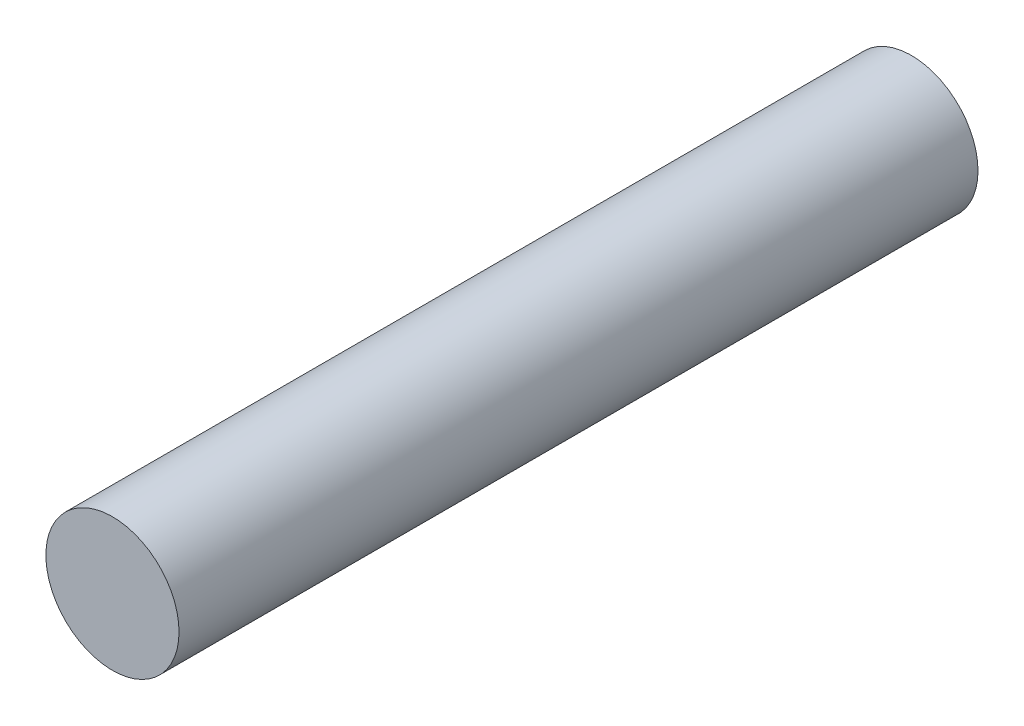
ISO-10303-21;
HEADER;
FILE_DESCRIPTION(('STEP AP214'),'2;1');
FILE_NAME('part.step','',(''),(''),'','','');
FILE_SCHEMA(('AUTOMOTIVE_DESIGN { 1 0 10303 214 1 1 1 1 }'));
ENDSEC;
DATA;
#1=APPLICATION_CONTEXT('core data for automotive mechanical design processes');
#2=APPLICATION_PROTOCOL_DEFINITION('international standard','automotive_design',2000,#1);
#3=PRODUCT_CONTEXT('',#1,'mechanical');
#4=PRODUCT('Part','Part','',(#3));
#5=PRODUCT_RELATED_PRODUCT_CATEGORY('part','',(#4));
#6=PRODUCT_DEFINITION_FORMATION('','',#4);
#7=PRODUCT_DEFINITION_CONTEXT('part definition',#1,'design');
#8=PRODUCT_DEFINITION('design','',#6,#7);
#9=PRODUCT_DEFINITION_SHAPE('','',#8);
#10=(LENGTH_UNIT() NAMED_UNIT(*) SI_UNIT(.MILLI.,.METRE.));
#11=(NAMED_UNIT(*) PLANE_ANGLE_UNIT() SI_UNIT($,.RADIAN.));
#12=(NAMED_UNIT(*) SI_UNIT($,.STERADIAN.) SOLID_ANGLE_UNIT());
#13=UNCERTAINTY_MEASURE_WITH_UNIT(LENGTH_MEASURE(1.E-05),#10,'distance_accuracy_value','');
#14=(GEOMETRIC_REPRESENTATION_CONTEXT(3) GLOBAL_UNCERTAINTY_ASSIGNED_CONTEXT((#13)) GLOBAL_UNIT_ASSIGNED_CONTEXT((#10,
#11,#12)) REPRESENTATION_CONTEXT('',''));
#15=CARTESIAN_POINT('',(0.,0.,0.));
#16=DIRECTION('',(0.,0.,1.));
#17=DIRECTION('',(1.,0.,0.));
#18=AXIS2_PLACEMENT_3D('',#15,#16,#17);
#19=CARTESIAN_POINT('',(0.,0.,150.));
#20=DIRECTION('',(0.,0.,-1.));
#21=DIRECTION('',(-1.,0.,0.));
#22=AXIS2_PLACEMENT_3D('',#19,#20,#21);
#23=CYLINDRICAL_SURFACE('',#22,12.5);
#24=CARTESIAN_POINT('',(0.,0.,150.));
#25=DIRECTION('',(0.,0.,1.));
#26=DIRECTION('',(1.,0.,0.));
#27=AXIS2_PLACEMENT_3D('',#24,#25,#26);
#28=CIRCLE('',#27,12.5);
#29=CARTESIAN_POINT('',(12.5,0.,150.));
#30=VERTEX_POINT('',#29);
#31=EDGE_CURVE('E10',#30,#30,#28,.T.);
#32=ORIENTED_EDGE('',*,*,#31,.F.);
#33=EDGE_LOOP('',(#32));
#34=FACE_BOUND('',#33,.T.);
#35=CARTESIAN_POINT('',(0.,0.,0.));
#36=DIRECTION('',(0.,0.,1.));
#37=DIRECTION('',(1.,0.,0.));
#38=AXIS2_PLACEMENT_3D('',#35,#36,#37);
#39=CIRCLE('',#38,12.5);
#40=CARTESIAN_POINT('',(12.5,0.,0.));
#41=VERTEX_POINT('',#40);
#42=EDGE_CURVE('E32',#41,#41,#39,.T.);
#43=ORIENTED_EDGE('',*,*,#42,.T.);
#44=EDGE_LOOP('',(#43));
#45=FACE_BOUND('',#44,.T.);
#46=ADVANCED_FACE('F29',(#34,#45),#23,.T.);
#47=CARTESIAN_POINT('',(0.,0.,150.));
#48=DIRECTION('',(0.,0.,1.));
#49=DIRECTION('',(1.,0.,0.));
#50=AXIS2_PLACEMENT_3D('',#47,#48,#49);
#51=PLANE('',#50);
#52=ORIENTED_EDGE('',*,*,#31,.T.);
#53=EDGE_LOOP('',(#52));
#54=FACE_BOUND('',#53,.T.);
#55=ADVANCED_FACE('F44',(#54),#51,.T.);
#56=CARTESIAN_POINT('',(0.,0.,0.));
#57=DIRECTION('',(0.,0.,1.));
#58=DIRECTION('',(1.,0.,0.));
#59=AXIS2_PLACEMENT_3D('',#56,#57,#58);
#60=PLANE('',#59);
#61=ORIENTED_EDGE('',*,*,#42,.F.);
#62=EDGE_LOOP('',(#61));
#63=FACE_BOUND('',#62,.T.);
#64=ADVANCED_FACE('F42',(#63),#60,.F.);
#65=CLOSED_SHELL('',(#46,#55,#64));
#66=MANIFOLD_SOLID_BREP('B2',#65);
#67=ADVANCED_BREP_SHAPE_REPRESENTATION('',(#18,#66),#14);
#68=SHAPE_DEFINITION_REPRESENTATION(#9,#67);
ENDSEC;
END-ISO-10303-21;
